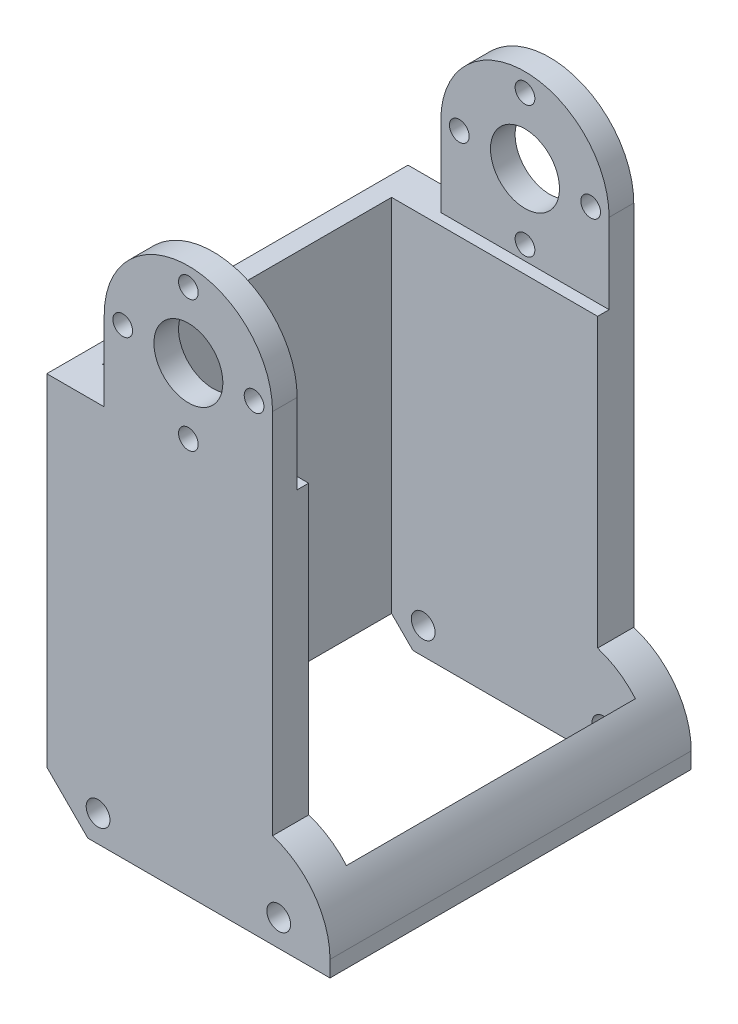
ISO-10303-21;
HEADER;
FILE_DESCRIPTION(('STEP AP214'),'2;1');
FILE_NAME('part.step','',(''),(''),'','','');
FILE_SCHEMA(('AUTOMOTIVE_DESIGN { 1 0 10303 214 1 1 1 1 }'));
ENDSEC;
DATA;
#1=APPLICATION_CONTEXT('core data for automotive mechanical design processes');
#2=APPLICATION_PROTOCOL_DEFINITION('international standard','automotive_design',2000,#1);
#3=PRODUCT_CONTEXT('',#1,'mechanical');
#4=PRODUCT('Part','Part','',(#3));
#5=PRODUCT_RELATED_PRODUCT_CATEGORY('part','',(#4));
#6=PRODUCT_DEFINITION_FORMATION('','',#4);
#7=PRODUCT_DEFINITION_CONTEXT('part definition',#1,'design');
#8=PRODUCT_DEFINITION('design','',#6,#7);
#9=PRODUCT_DEFINITION_SHAPE('','',#8);
#10=(LENGTH_UNIT() NAMED_UNIT(*) SI_UNIT(.MILLI.,.METRE.));
#11=(NAMED_UNIT(*) PLANE_ANGLE_UNIT() SI_UNIT($,.RADIAN.));
#12=(NAMED_UNIT(*) SI_UNIT($,.STERADIAN.) SOLID_ANGLE_UNIT());
#13=UNCERTAINTY_MEASURE_WITH_UNIT(LENGTH_MEASURE(1.E-05),#10,'distance_accuracy_value','');
#14=(GEOMETRIC_REPRESENTATION_CONTEXT(3) GLOBAL_UNCERTAINTY_ASSIGNED_CONTEXT((#13)) GLOBAL_UNIT_ASSIGNED_CONTEXT((#10,
#11,#12)) REPRESENTATION_CONTEXT('',''));
#15=CARTESIAN_POINT('',(0.,0.,0.));
#16=DIRECTION('',(0.,0.,1.));
#17=DIRECTION('',(1.,0.,0.));
#18=AXIS2_PLACEMENT_3D('',#15,#16,#17);
#19=CARTESIAN_POINT('',(0.,0.,-22.));
#20=DIRECTION('',(0.,0.,1.));
#21=DIRECTION('',(1.,0.,0.));
#22=AXIS2_PLACEMENT_3D('',#19,#20,#21);
#23=PLANE('',#22);
#24=CARTESIAN_POINT('',(-8.,0.,-22.));
#25=DIRECTION('',(0.,0.,1.));
#26=DIRECTION('',(1.,0.,0.));
#27=AXIS2_PLACEMENT_3D('',#24,#25,#26);
#28=CIRCLE('',#27,1.2);
#29=CARTESIAN_POINT('',(-6.8,0.,-22.));
#30=VERTEX_POINT('',#29);
#31=EDGE_CURVE('E469',#30,#30,#28,.T.);
#32=ORIENTED_EDGE('',*,*,#31,.T.);
#33=EDGE_LOOP('',(#32));
#34=FACE_BOUND('',#33,.T.);
#35=CARTESIAN_POINT('',(0.,8.,-22.));
#36=DIRECTION('',(0.,0.,1.));
#37=DIRECTION('',(1.,0.,0.));
#38=AXIS2_PLACEMENT_3D('',#35,#36,#37);
#39=CIRCLE('',#38,1.2);
#40=CARTESIAN_POINT('',(1.2,8.,-22.));
#41=VERTEX_POINT('',#40);
#42=EDGE_CURVE('E473',#41,#41,#39,.T.);
#43=ORIENTED_EDGE('',*,*,#42,.T.);
#44=EDGE_LOOP('',(#43));
#45=FACE_BOUND('',#44,.T.);
#46=CARTESIAN_POINT('',(8.,0.,-22.));
#47=DIRECTION('',(0.,0.,1.));
#48=DIRECTION('',(1.,0.,0.));
#49=AXIS2_PLACEMENT_3D('',#46,#47,#48);
#50=CIRCLE('',#49,1.2);
#51=CARTESIAN_POINT('',(9.2,0.,-22.));
#52=VERTEX_POINT('',#51);
#53=EDGE_CURVE('E477',#52,#52,#50,.T.);
#54=ORIENTED_EDGE('',*,*,#53,.T.);
#55=EDGE_LOOP('',(#54));
#56=FACE_BOUND('',#55,.T.);
#57=CARTESIAN_POINT('',(0.,0.,-22.));
#58=DIRECTION('',(0.,0.,1.));
#59=DIRECTION('',(1.,0.,0.));
#60=AXIS2_PLACEMENT_3D('',#57,#58,#59);
#61=CIRCLE('',#60,4.2);
#62=CARTESIAN_POINT('',(4.2,0.,-22.));
#63=VERTEX_POINT('',#62);
#64=EDGE_CURVE('E481',#63,#63,#61,.T.);
#65=ORIENTED_EDGE('',*,*,#64,.T.);
#66=EDGE_LOOP('',(#65));
#67=FACE_BOUND('',#66,.T.);
#68=CARTESIAN_POINT('',(0.,-8.,-22.));
#69=DIRECTION('',(0.,0.,1.));
#70=DIRECTION('',(1.,0.,0.));
#71=AXIS2_PLACEMENT_3D('',#68,#69,#70);
#72=CIRCLE('',#71,1.2);
#73=CARTESIAN_POINT('',(1.19999999999994,-8.,-22.));
#74=VERTEX_POINT('',#73);
#75=EDGE_CURVE('E496',#74,#74,#72,.T.);
#76=ORIENTED_EDGE('',*,*,#75,.T.);
#77=EDGE_LOOP('',(#76));
#78=FACE_BOUND('',#77,.T.);
#79=CARTESIAN_POINT('',(11.,-53.,-22.));
#80=DIRECTION('',(0.,0.,1.));
#81=DIRECTION('',(1.,0.,0.));
#82=AXIS2_PLACEMENT_3D('',#79,#80,#81);
#83=CIRCLE('',#82,1.45);
#84=CARTESIAN_POINT('',(12.45,-53.,-22.));
#85=VERTEX_POINT('',#84);
#86=EDGE_CURVE('E350',#85,#85,#83,.T.);
#87=ORIENTED_EDGE('',*,*,#86,.T.);
#88=EDGE_LOOP('',(#87));
#89=FACE_BOUND('',#88,.T.);
#90=CARTESIAN_POINT('',(-11.,-53.,-22.));
#91=DIRECTION('',(0.,0.,1.));
#92=DIRECTION('',(1.,0.,0.));
#93=AXIS2_PLACEMENT_3D('',#90,#91,#92);
#94=CIRCLE('',#93,1.45);
#95=CARTESIAN_POINT('',(-9.55,-53.,-22.));
#96=VERTEX_POINT('',#95);
#97=EDGE_CURVE('E338',#96,#96,#94,.T.);
#98=ORIENTED_EDGE('',*,*,#97,.T.);
#99=EDGE_LOOP('',(#98));
#100=FACE_BOUND('',#99,.T.);
#101=DIRECTION('',(0.,-1.,0.));
#102=VECTOR('',#101,1.);
#103=CARTESIAN_POINT('',(10.25,0.,-22.));
#104=LINE('',#103,#102);
#105=CARTESIAN_POINT('',(10.25,0.,-22.));
#106=VERTEX_POINT('',#105);
#107=CARTESIAN_POINT('',(10.25,-44.75,-22.));
#108=VERTEX_POINT('',#107);
#109=EDGE_CURVE('E493',#106,#108,#104,.T.);
#110=ORIENTED_EDGE('',*,*,#109,.T.);
#111=CARTESIAN_POINT('',(7.25,-54.2893920141695,-22.));
#112=DIRECTION('',(0.,0.,1.));
#113=DIRECTION('',(1.,0.,0.));
#114=AXIS2_PLACEMENT_3D('',#111,#112,#113);
#115=CIRCLE('',#114,10.);
#116=CARTESIAN_POINT('',(17.25,-54.2893920141695,-22.));
#117=VERTEX_POINT('',#116);
#118=EDGE_CURVE('E132',#108,#117,#115,.F.);
#119=ORIENTED_EDGE('',*,*,#118,.T.);
#120=DIRECTION('',(0.,1.,0.));
#121=VECTOR('',#120,1.);
#122=CARTESIAN_POINT('',(17.25,-75.25,-22.));
#123=LINE('',#122,#121);
#124=CARTESIAN_POINT('',(17.25,-56.25,-22.));
#125=VERTEX_POINT('',#124);
#126=EDGE_CURVE('E342',#125,#117,#123,.T.);
#127=ORIENTED_EDGE('',*,*,#126,.F.);
#128=DIRECTION('',(1.,0.,0.));
#129=VECTOR('',#128,1.);
#130=CARTESIAN_POINT('',(0.,-56.25,-22.));
#131=LINE('',#130,#129);
#132=CARTESIAN_POINT('',(-12.25,-56.25,-22.));
#133=VERTEX_POINT('',#132);
#134=EDGE_CURVE('E331',#133,#125,#131,.T.);
#135=ORIENTED_EDGE('',*,*,#134,.F.);
#136=DIRECTION('',(0.707106781186544,-0.707106781186551,0.));
#137=VECTOR('',#136,1.);
#138=CARTESIAN_POINT('',(-17.25,-51.2499999999999,-22.));
#139=LINE('',#138,#137);
#140=CARTESIAN_POINT('',(-17.25,-51.2499999999999,-22.));
#141=VERTEX_POINT('',#140);
#142=EDGE_CURVE('E547',#133,#141,#139,.F.);
#143=ORIENTED_EDGE('',*,*,#142,.T.);
#144=DIRECTION('',(0.,1.,0.));
#145=VECTOR('',#144,1.);
#146=CARTESIAN_POINT('',(-17.25,-75.25,-22.));
#147=LINE('',#146,#145);
#148=CARTESIAN_POINT('',(-17.25,-9.75,-22.));
#149=VERTEX_POINT('',#148);
#150=EDGE_CURVE('E376',#141,#149,#147,.T.);
#151=ORIENTED_EDGE('',*,*,#150,.T.);
#152=DIRECTION('',(-1.,0.,0.));
#153=VECTOR('',#152,1.);
#154=CARTESIAN_POINT('',(-10.25,-9.75,-22.));
#155=LINE('',#154,#153);
#156=CARTESIAN_POINT('',(-10.25,-9.75,-22.));
#157=VERTEX_POINT('',#156);
#158=EDGE_CURVE('E365',#157,#149,#155,.T.);
#159=ORIENTED_EDGE('',*,*,#158,.F.);
#160=DIRECTION('',(0.,-1.,0.));
#161=VECTOR('',#160,1.);
#162=CARTESIAN_POINT('',(-10.25,0.,-22.));
#163=LINE('',#162,#161);
#164=CARTESIAN_POINT('',(-10.25,0.,-22.));
#165=VERTEX_POINT('',#164);
#166=EDGE_CURVE('E489',#165,#157,#163,.T.);
#167=ORIENTED_EDGE('',*,*,#166,.F.);
#168=CARTESIAN_POINT('',(0.,0.,-22.));
#169=DIRECTION('',(0.,0.,1.));
#170=DIRECTION('',(1.,0.,0.));
#171=AXIS2_PLACEMENT_3D('',#168,#169,#170);
#172=CIRCLE('',#171,10.25);
#173=EDGE_CURVE('E485',#106,#165,#172,.T.);
#174=ORIENTED_EDGE('',*,*,#173,.F.);
#175=EDGE_LOOP('',(#110,#119,#127,#135,#143,#151,#159,#167,#174));
#176=FACE_BOUND('',#175,.T.);
#177=ADVANCED_FACE('F109',(#34,#45,#56,#67,#78,#89,#100,#176),#23,.F.);
#178=CARTESIAN_POINT('',(0.,0.,22.));
#179=DIRECTION('',(0.,0.,1.));
#180=DIRECTION('',(1.,0.,0.));
#181=AXIS2_PLACEMENT_3D('',#178,#179,#180);
#182=PLANE('',#181);
#183=DIRECTION('',(0.,1.,0.));
#184=VECTOR('',#183,1.);
#185=CARTESIAN_POINT('',(17.25,-75.25,22.));
#186=LINE('',#185,#184);
#187=CARTESIAN_POINT('',(17.25,-56.25,22.));
#188=VERTEX_POINT('',#187);
#189=CARTESIAN_POINT('',(17.25,-54.2893920141695,22.));
#190=VERTEX_POINT('',#189);
#191=EDGE_CURVE('E252',#188,#190,#186,.T.);
#192=ORIENTED_EDGE('',*,*,#191,.T.);
#193=CARTESIAN_POINT('',(7.25,-54.2893920141695,22.));
#194=DIRECTION('',(0.,0.,1.));
#195=DIRECTION('',(1.,0.,0.));
#196=AXIS2_PLACEMENT_3D('',#193,#194,#195);
#197=CIRCLE('',#196,10.);
#198=CARTESIAN_POINT('',(10.25,-44.75,22.));
#199=VERTEX_POINT('',#198);
#200=EDGE_CURVE('E12',#190,#199,#197,.T.);
#201=ORIENTED_EDGE('',*,*,#200,.T.);
#202=DIRECTION('',(0.,-1.,0.));
#203=VECTOR('',#202,1.);
#204=CARTESIAN_POINT('',(10.25,0.,22.));
#205=LINE('',#204,#203);
#206=CARTESIAN_POINT('',(10.25,0.,22.));
#207=VERTEX_POINT('',#206);
#208=EDGE_CURVE('E251',#207,#199,#205,.T.);
#209=ORIENTED_EDGE('',*,*,#208,.F.);
#210=CARTESIAN_POINT('',(0.,0.,22.));
#211=DIRECTION('',(0.,0.,1.));
#212=DIRECTION('',(1.,0.,0.));
#213=AXIS2_PLACEMENT_3D('',#210,#211,#212);
#214=CIRCLE('',#213,10.25);
#215=CARTESIAN_POINT('',(-10.25,0.,22.));
#216=VERTEX_POINT('',#215);
#217=EDGE_CURVE('E460',#207,#216,#214,.T.);
#218=ORIENTED_EDGE('',*,*,#217,.T.);
#219=DIRECTION('',(0.,-1.,0.));
#220=VECTOR('',#219,1.);
#221=CARTESIAN_POINT('',(-10.25,0.,22.));
#222=LINE('',#221,#220);
#223=CARTESIAN_POINT('',(-10.25,-9.75,22.));
#224=VERTEX_POINT('',#223);
#225=EDGE_CURVE('E266',#216,#224,#222,.T.);
#226=ORIENTED_EDGE('',*,*,#225,.T.);
#227=DIRECTION('',(1.,0.,0.));
#228=VECTOR('',#227,1.);
#229=CARTESIAN_POINT('',(-10.25,-9.75,22.));
#230=LINE('',#229,#228);
#231=CARTESIAN_POINT('',(-17.25,-9.75,22.));
#232=VERTEX_POINT('',#231);
#233=EDGE_CURVE('E373',#232,#224,#230,.T.);
#234=ORIENTED_EDGE('',*,*,#233,.F.);
#235=DIRECTION('',(0.,1.,0.));
#236=VECTOR('',#235,1.);
#237=CARTESIAN_POINT('',(-17.25,-75.25,22.));
#238=LINE('',#237,#236);
#239=CARTESIAN_POINT('',(-17.25,-51.2499999999999,22.));
#240=VERTEX_POINT('',#239);
#241=EDGE_CURVE('E377',#240,#232,#238,.T.);
#242=ORIENTED_EDGE('',*,*,#241,.F.);
#243=DIRECTION('',(-0.707106781186544,0.707106781186551,0.));
#244=VECTOR('',#243,1.);
#245=CARTESIAN_POINT('',(-34.25,-34.2499999999997,22.));
#246=LINE('',#245,#244);
#247=CARTESIAN_POINT('',(-12.25,-56.25,22.));
#248=VERTEX_POINT('',#247);
#249=EDGE_CURVE('E529',#240,#248,#246,.F.);
#250=ORIENTED_EDGE('',*,*,#249,.T.);
#251=DIRECTION('',(1.,0.,0.));
#252=VECTOR('',#251,1.);
#253=CARTESIAN_POINT('',(0.,-56.25,22.));
#254=LINE('',#253,#252);
#255=EDGE_CURVE('E335',#248,#188,#254,.T.);
#256=ORIENTED_EDGE('',*,*,#255,.T.);
#257=EDGE_LOOP('',(#192,#201,#209,#218,#226,#234,#242,#250,#256));
#258=FACE_BOUND('',#257,.T.);
#259=CARTESIAN_POINT('',(0.,-8.,22.));
#260=DIRECTION('',(0.,0.,1.));
#261=DIRECTION('',(1.,0.,0.));
#262=AXIS2_PLACEMENT_3D('',#259,#260,#261);
#263=CIRCLE('',#262,1.2);
#264=CARTESIAN_POINT('',(1.19999999999994,-8.,22.));
#265=VERTEX_POINT('',#264);
#266=EDGE_CURVE('E265',#265,#265,#263,.T.);
#267=ORIENTED_EDGE('',*,*,#266,.F.);
#268=EDGE_LOOP('',(#267));
#269=FACE_BOUND('',#268,.T.);
#270=CARTESIAN_POINT('',(0.,0.,22.));
#271=DIRECTION('',(0.,0.,1.));
#272=DIRECTION('',(1.,0.,0.));
#273=AXIS2_PLACEMENT_3D('',#270,#271,#272);
#274=CIRCLE('',#273,4.2);
#275=CARTESIAN_POINT('',(4.2,0.,22.));
#276=VERTEX_POINT('',#275);
#277=EDGE_CURVE('E456',#276,#276,#274,.T.);
#278=ORIENTED_EDGE('',*,*,#277,.F.);
#279=EDGE_LOOP('',(#278));
#280=FACE_BOUND('',#279,.T.);
#281=CARTESIAN_POINT('',(8.,0.,22.));
#282=DIRECTION('',(0.,0.,1.));
#283=DIRECTION('',(1.,0.,0.));
#284=AXIS2_PLACEMENT_3D('',#281,#282,#283);
#285=CIRCLE('',#284,1.2);
#286=CARTESIAN_POINT('',(9.2,0.,22.));
#287=VERTEX_POINT('',#286);
#288=EDGE_CURVE('E452',#287,#287,#285,.T.);
#289=ORIENTED_EDGE('',*,*,#288,.F.);
#290=EDGE_LOOP('',(#289));
#291=FACE_BOUND('',#290,.T.);
#292=CARTESIAN_POINT('',(0.,8.,22.));
#293=DIRECTION('',(0.,0.,1.));
#294=DIRECTION('',(1.,0.,0.));
#295=AXIS2_PLACEMENT_3D('',#292,#293,#294);
#296=CIRCLE('',#295,1.2);
#297=CARTESIAN_POINT('',(1.2,8.,22.));
#298=VERTEX_POINT('',#297);
#299=EDGE_CURVE('E448',#298,#298,#296,.T.);
#300=ORIENTED_EDGE('',*,*,#299,.F.);
#301=EDGE_LOOP('',(#300));
#302=FACE_BOUND('',#301,.T.);
#303=CARTESIAN_POINT('',(-8.,0.,22.));
#304=DIRECTION('',(0.,0.,1.));
#305=DIRECTION('',(1.,0.,0.));
#306=AXIS2_PLACEMENT_3D('',#303,#304,#305);
#307=CIRCLE('',#306,1.2);
#308=CARTESIAN_POINT('',(-6.8,0.,22.));
#309=VERTEX_POINT('',#308);
#310=EDGE_CURVE('E444',#309,#309,#307,.T.);
#311=ORIENTED_EDGE('',*,*,#310,.F.);
#312=EDGE_LOOP('',(#311));
#313=FACE_BOUND('',#312,.T.);
#314=CARTESIAN_POINT('',(11.,-53.,22.));
#315=DIRECTION('',(0.,0.,1.));
#316=DIRECTION('',(1.,0.,0.));
#317=AXIS2_PLACEMENT_3D('',#314,#315,#316);
#318=CIRCLE('',#317,1.45);
#319=CARTESIAN_POINT('',(12.45,-53.,22.));
#320=VERTEX_POINT('',#319);
#321=EDGE_CURVE('E330',#320,#320,#318,.T.);
#322=ORIENTED_EDGE('',*,*,#321,.F.);
#323=EDGE_LOOP('',(#322));
#324=FACE_BOUND('',#323,.T.);
#325=CARTESIAN_POINT('',(-11.,-53.,22.));
#326=DIRECTION('',(0.,0.,1.));
#327=DIRECTION('',(1.,0.,0.));
#328=AXIS2_PLACEMENT_3D('',#325,#326,#327);
#329=CIRCLE('',#328,1.45);
#330=CARTESIAN_POINT('',(-9.55,-53.,22.));
#331=VERTEX_POINT('',#330);
#332=EDGE_CURVE('E346',#331,#331,#329,.T.);
#333=ORIENTED_EDGE('',*,*,#332,.F.);
#334=EDGE_LOOP('',(#333));
#335=FACE_BOUND('',#334,.T.);
#336=ADVANCED_FACE('F248',(#258,#269,#280,#291,#302,#313,#324,#335),#182,.T.);
#337=CARTESIAN_POINT('',(-17.25,-75.25,-22.));
#338=DIRECTION('',(-1.,0.,0.));
#339=DIRECTION('',(0.,0.,1.));
#340=AXIS2_PLACEMENT_3D('',#337,#338,#339);
#341=PLANE('',#340);
#342=ORIENTED_EDGE('',*,*,#150,.F.);
#343=DIRECTION('',(0.,0.,1.));
#344=VECTOR('',#343,1.);
#345=CARTESIAN_POINT('',(-17.25,-51.2499999999999,-22.));
#346=LINE('',#345,#344);
#347=EDGE_CURVE('E525',#141,#240,#346,.T.);
#348=ORIENTED_EDGE('',*,*,#347,.T.);
#349=ORIENTED_EDGE('',*,*,#241,.T.);
#350=DIRECTION('',(0.,0.,1.));
#351=VECTOR('',#350,1.);
#352=CARTESIAN_POINT('',(-17.25,-9.75,-22.));
#353=LINE('',#352,#351);
#354=EDGE_CURVE('E369',#149,#232,#353,.T.);
#355=ORIENTED_EDGE('',*,*,#354,.F.);
#356=EDGE_LOOP('',(#342,#348,#349,#355));
#357=FACE_BOUND('',#356,.T.);
#358=ADVANCED_FACE('F612',(#357),#341,.T.);
#359=CARTESIAN_POINT('',(17.25,-75.25,-22.));
#360=DIRECTION('',(1.,0.,0.));
#361=DIRECTION('',(0.,0.,-1.));
#362=AXIS2_PLACEMENT_3D('',#359,#360,#361);
#363=PLANE('',#362);
#364=ORIENTED_EDGE('',*,*,#126,.T.);
#365=DIRECTION('',(0.,0.,1.));
#366=VECTOR('',#365,1.);
#367=CARTESIAN_POINT('',(17.25,-54.2893920141695,22.));
#368=LINE('',#367,#366);
#369=EDGE_CURVE('E118',#117,#190,#368,.T.);
#370=ORIENTED_EDGE('',*,*,#369,.T.);
#371=ORIENTED_EDGE('',*,*,#191,.F.);
#372=DIRECTION('',(0.,0.,1.));
#373=VECTOR('',#372,1.);
#374=CARTESIAN_POINT('',(17.25,-56.25,-22.));
#375=LINE('',#374,#373);
#376=EDGE_CURVE('E334',#125,#188,#375,.T.);
#377=ORIENTED_EDGE('',*,*,#376,.F.);
#378=EDGE_LOOP('',(#364,#370,#371,#377));
#379=FACE_BOUND('',#378,.T.);
#380=ADVANCED_FACE('F608',(#379),#363,.T.);
#381=CARTESIAN_POINT('',(10.25,0.,-22.));
#382=DIRECTION('',(-1.,0.,0.));
#383=DIRECTION('',(0.,0.,1.));
#384=AXIS2_PLACEMENT_3D('',#381,#382,#383);
#385=PLANE('',#384);
#386=ORIENTED_EDGE('',*,*,#208,.T.);
#387=DIRECTION('',(0.,0.,-1.));
#388=VECTOR('',#387,1.);
#389=CARTESIAN_POINT('',(10.25,-44.75,22.));
#390=LINE('',#389,#388);
#391=CARTESIAN_POINT('',(10.25,-44.75,17.6));
#392=VERTEX_POINT('',#391);
#393=EDGE_CURVE('E258',#199,#392,#390,.T.);
#394=ORIENTED_EDGE('',*,*,#393,.T.);
#395=DIRECTION('',(0.,-1.,0.));
#396=VECTOR('',#395,1.);
#397=CARTESIAN_POINT('',(10.25,10.25,17.6));
#398=LINE('',#397,#396);
#399=CARTESIAN_POINT('',(10.25,-9.75,17.6));
#400=VERTEX_POINT('',#399);
#401=EDGE_CURVE('E280',#400,#392,#398,.T.);
#402=ORIENTED_EDGE('',*,*,#401,.F.);
#403=DIRECTION('',(0.,0.,-1.));
#404=VECTOR('',#403,1.);
#405=CARTESIAN_POINT('',(10.25,-9.75,22.));
#406=LINE('',#405,#404);
#407=CARTESIAN_POINT('',(10.25,-9.75,19.));
#408=VERTEX_POINT('',#407);
#409=EDGE_CURVE('E276',#408,#400,#406,.T.);
#410=ORIENTED_EDGE('',*,*,#409,.F.);
#411=DIRECTION('',(0.,1.,0.));
#412=VECTOR('',#411,1.);
#413=CARTESIAN_POINT('',(10.25,10.25,19.));
#414=LINE('',#413,#412);
#415=CARTESIAN_POINT('',(10.25,0.,19.));
#416=VERTEX_POINT('',#415);
#417=EDGE_CURVE('E387',#408,#416,#414,.T.);
#418=ORIENTED_EDGE('',*,*,#417,.T.);
#419=DIRECTION('',(0.,0.,1.));
#420=VECTOR('',#419,1.);
#421=CARTESIAN_POINT('',(10.25,0.,-22.));
#422=LINE('',#421,#420);
#423=EDGE_CURVE('E262',#416,#207,#422,.T.);
#424=ORIENTED_EDGE('',*,*,#423,.T.);
#425=EDGE_LOOP('',(#386,#394,#402,#410,#418,#424));
#426=FACE_BOUND('',#425,.T.);
#427=ADVANCED_FACE('F257',(#426),#385,.F.);
#428=CARTESIAN_POINT('',(-10.25,0.,-22.));
#429=DIRECTION('',(-1.,0.,0.));
#430=DIRECTION('',(0.,0.,1.));
#431=AXIS2_PLACEMENT_3D('',#428,#429,#430);
#432=PLANE('',#431);
#433=ORIENTED_EDGE('',*,*,#166,.T.);
#434=DIRECTION('',(0.,0.,-1.));
#435=VECTOR('',#434,1.);
#436=CARTESIAN_POINT('',(-10.25,-9.75,-22.));
#437=LINE('',#436,#435);
#438=CARTESIAN_POINT('',(-10.25,-9.75,-19.));
#439=VERTEX_POINT('',#438);
#440=EDGE_CURVE('E359',#439,#157,#437,.T.);
#441=ORIENTED_EDGE('',*,*,#440,.F.);
#442=DIRECTION('',(0.,-1.,0.));
#443=VECTOR('',#442,1.);
#444=CARTESIAN_POINT('',(-10.25,10.25,-19.));
#445=LINE('',#444,#443);
#446=CARTESIAN_POINT('',(-10.25,0.,-19.));
#447=VERTEX_POINT('',#446);
#448=EDGE_CURVE('E380',#447,#439,#445,.T.);
#449=ORIENTED_EDGE('',*,*,#448,.F.);
#450=DIRECTION('',(0.,0.,1.));
#451=VECTOR('',#450,1.);
#452=CARTESIAN_POINT('',(-10.25,0.,-22.));
#453=LINE('',#452,#451);
#454=EDGE_CURVE('E506',#165,#447,#453,.T.);
#455=ORIENTED_EDGE('',*,*,#454,.F.);
#456=EDGE_LOOP('',(#433,#441,#449,#455));
#457=FACE_BOUND('',#456,.T.);
#458=ADVANCED_FACE('F618',(#457),#432,.T.);
#459=DIRECTION('',(0.,1.,0.));
#460=VECTOR('',#459,1.);
#461=CARTESIAN_POINT('',(-10.25,10.25,19.));
#462=LINE('',#461,#460);
#463=CARTESIAN_POINT('',(-10.25,-9.75,19.));
#464=VERTEX_POINT('',#463);
#465=CARTESIAN_POINT('',(-10.25,0.,19.));
#466=VERTEX_POINT('',#465);
#467=EDGE_CURVE('E388',#464,#466,#462,.T.);
#468=ORIENTED_EDGE('',*,*,#467,.F.);
#469=EDGE_CURVE('E362',#224,#464,#437,.T.);
#470=ORIENTED_EDGE('',*,*,#469,.F.);
#471=ORIENTED_EDGE('',*,*,#225,.F.);
#472=EDGE_CURVE('E500',#466,#216,#453,.T.);
#473=ORIENTED_EDGE('',*,*,#472,.F.);
#474=EDGE_LOOP('',(#468,#470,#471,#473));
#475=FACE_BOUND('',#474,.T.);
#476=ADVANCED_FACE('F702',(#475),#432,.T.);
#477=CARTESIAN_POINT('',(0.,0.,-22.));
#478=DIRECTION('',(0.,0.,1.));
#479=DIRECTION('',(1.,0.,0.));
#480=AXIS2_PLACEMENT_3D('',#477,#478,#479);
#481=CYLINDRICAL_SURFACE('',#480,10.25);
#482=CARTESIAN_POINT('',(0.,0.,-19.));
#483=DIRECTION('',(0.,0.,-1.));
#484=DIRECTION('',(-1.,0.,0.));
#485=AXIS2_PLACEMENT_3D('',#482,#483,#484);
#486=CIRCLE('',#485,10.25);
#487=CARTESIAN_POINT('',(10.25,0.,-19.));
#488=VERTEX_POINT('',#487);
#489=EDGE_CURVE('E441',#488,#447,#486,.F.);
#490=ORIENTED_EDGE('',*,*,#489,.F.);
#491=EDGE_CURVE('E501',#106,#488,#422,.T.);
#492=ORIENTED_EDGE('',*,*,#491,.F.);
#493=ORIENTED_EDGE('',*,*,#173,.T.);
#494=ORIENTED_EDGE('',*,*,#454,.T.);
#495=EDGE_LOOP('',(#490,#492,#493,#494));
#496=FACE_BOUND('',#495,.T.);
#497=ADVANCED_FACE('F622',(#496),#481,.T.);
#498=CARTESIAN_POINT('',(0.,0.,-22.));
#499=DIRECTION('',(0.,0.,1.));
#500=DIRECTION('',(1.,0.,0.));
#501=AXIS2_PLACEMENT_3D('',#498,#499,#500);
#502=CYLINDRICAL_SURFACE('',#501,4.2);
#503=CARTESIAN_POINT('',(0.,0.,-19.));
#504=DIRECTION('',(0.,0.,-1.));
#505=DIRECTION('',(-1.,0.,0.));
#506=AXIS2_PLACEMENT_3D('',#503,#504,#505);
#507=CIRCLE('',#506,4.2);
#508=CARTESIAN_POINT('',(-4.2,0.,-19.));
#509=VERTEX_POINT('',#508);
#510=EDGE_CURVE('E437',#509,#509,#507,.F.);
#511=ORIENTED_EDGE('',*,*,#510,.T.);
#512=EDGE_LOOP('',(#511));
#513=FACE_BOUND('',#512,.T.);
#514=ORIENTED_EDGE('',*,*,#64,.F.);
#515=EDGE_LOOP('',(#514));
#516=FACE_BOUND('',#515,.T.);
#517=ADVANCED_FACE('F640',(#513,#516),#502,.F.);
#518=CARTESIAN_POINT('',(8.,0.,-22.));
#519=DIRECTION('',(0.,0.,1.));
#520=DIRECTION('',(1.,0.,0.));
#521=AXIS2_PLACEMENT_3D('',#518,#519,#520);
#522=CYLINDRICAL_SURFACE('',#521,1.2);
#523=CARTESIAN_POINT('',(8.,0.,-19.));
#524=DIRECTION('',(0.,0.,-1.));
#525=DIRECTION('',(-1.,0.,0.));
#526=AXIS2_PLACEMENT_3D('',#523,#524,#525);
#527=CIRCLE('',#526,1.2);
#528=CARTESIAN_POINT('',(6.8,0.,-19.));
#529=VERTEX_POINT('',#528);
#530=EDGE_CURVE('E433',#529,#529,#527,.F.);
#531=ORIENTED_EDGE('',*,*,#530,.T.);
#532=EDGE_LOOP('',(#531));
#533=FACE_BOUND('',#532,.T.);
#534=ORIENTED_EDGE('',*,*,#53,.F.);
#535=EDGE_LOOP('',(#534));
#536=FACE_BOUND('',#535,.T.);
#537=ADVANCED_FACE('F643',(#533,#536),#522,.F.);
#538=CARTESIAN_POINT('',(0.,8.,-22.));
#539=DIRECTION('',(0.,0.,1.));
#540=DIRECTION('',(1.,0.,0.));
#541=AXIS2_PLACEMENT_3D('',#538,#539,#540);
#542=CYLINDRICAL_SURFACE('',#541,1.2);
#543=CARTESIAN_POINT('',(0.,8.,-19.));
#544=DIRECTION('',(0.,0.,-1.));
#545=DIRECTION('',(-1.,0.,0.));
#546=AXIS2_PLACEMENT_3D('',#543,#544,#545);
#547=CIRCLE('',#546,1.2);
#548=CARTESIAN_POINT('',(-1.2,8.,-19.));
#549=VERTEX_POINT('',#548);
#550=EDGE_CURVE('E429',#549,#549,#547,.F.);
#551=ORIENTED_EDGE('',*,*,#550,.T.);
#552=EDGE_LOOP('',(#551));
#553=FACE_BOUND('',#552,.T.);
#554=ORIENTED_EDGE('',*,*,#42,.F.);
#555=EDGE_LOOP('',(#554));
#556=FACE_BOUND('',#555,.T.);
#557=ADVANCED_FACE('F716',(#553,#556),#542,.F.);
#558=CARTESIAN_POINT('',(-8.,0.,-22.));
#559=DIRECTION('',(0.,0.,1.));
#560=DIRECTION('',(1.,0.,0.));
#561=AXIS2_PLACEMENT_3D('',#558,#559,#560);
#562=CYLINDRICAL_SURFACE('',#561,1.2);
#563=CARTESIAN_POINT('',(-8.,0.,-19.));
#564=DIRECTION('',(0.,0.,-1.));
#565=DIRECTION('',(-1.,0.,0.));
#566=AXIS2_PLACEMENT_3D('',#563,#564,#565);
#567=CIRCLE('',#566,1.2);
#568=CARTESIAN_POINT('',(-9.2,0.,-19.));
#569=VERTEX_POINT('',#568);
#570=EDGE_CURVE('E425',#569,#569,#567,.F.);
#571=ORIENTED_EDGE('',*,*,#570,.T.);
#572=EDGE_LOOP('',(#571));
#573=FACE_BOUND('',#572,.T.);
#574=ORIENTED_EDGE('',*,*,#31,.F.);
#575=EDGE_LOOP('',(#574));
#576=FACE_BOUND('',#575,.T.);
#577=ADVANCED_FACE('F719',(#573,#576),#562,.F.);
#578=CARTESIAN_POINT('',(0.,-8.,-22.));
#579=DIRECTION('',(0.,0.,1.));
#580=DIRECTION('',(1.,0.,0.));
#581=AXIS2_PLACEMENT_3D('',#578,#579,#580);
#582=CYLINDRICAL_SURFACE('',#581,1.2);
#583=CARTESIAN_POINT('',(0.,-8.,-19.));
#584=DIRECTION('',(0.,0.,-1.));
#585=DIRECTION('',(-1.,0.,0.));
#586=AXIS2_PLACEMENT_3D('',#583,#584,#585);
#587=CIRCLE('',#586,1.2);
#588=CARTESIAN_POINT('',(-1.20000000000006,-8.,-19.));
#589=VERTEX_POINT('',#588);
#590=EDGE_CURVE('E424',#589,#589,#587,.F.);
#591=ORIENTED_EDGE('',*,*,#590,.T.);
#592=EDGE_LOOP('',(#591));
#593=FACE_BOUND('',#592,.T.);
#594=ORIENTED_EDGE('',*,*,#75,.F.);
#595=EDGE_LOOP('',(#594));
#596=FACE_BOUND('',#595,.T.);
#597=ADVANCED_FACE('F696',(#593,#596),#582,.F.);
#598=CARTESIAN_POINT('',(0.,0.,19.));
#599=DIRECTION('',(0.,0.,1.));
#600=DIRECTION('',(0.,-1.,0.));
#601=AXIS2_PLACEMENT_3D('',#598,#599,#600);
#602=CIRCLE('',#601,10.25);
#603=EDGE_CURVE('E421',#466,#416,#602,.F.);
#604=ORIENTED_EDGE('',*,*,#603,.F.);
#605=ORIENTED_EDGE('',*,*,#472,.T.);
#606=ORIENTED_EDGE('',*,*,#217,.F.);
#607=ORIENTED_EDGE('',*,*,#423,.F.);
#608=EDGE_LOOP('',(#604,#605,#606,#607));
#609=FACE_BOUND('',#608,.T.);
#610=ADVANCED_FACE('F699',(#609),#481,.T.);
#611=DIRECTION('',(0.,-1.,0.));
#612=VECTOR('',#611,1.);
#613=CARTESIAN_POINT('',(10.25,10.25,-19.));
#614=LINE('',#613,#612);
#615=CARTESIAN_POINT('',(10.25,-9.75,-19.));
#616=VERTEX_POINT('',#615);
#617=EDGE_CURVE('E383',#488,#616,#614,.T.);
#618=ORIENTED_EDGE('',*,*,#617,.T.);
#619=CARTESIAN_POINT('',(10.25,-9.75,-17.6));
#620=VERTEX_POINT('',#619);
#621=EDGE_CURVE('E271',#620,#616,#406,.T.);
#622=ORIENTED_EDGE('',*,*,#621,.F.);
#623=DIRECTION('',(0.,1.,0.));
#624=VECTOR('',#623,1.);
#625=CARTESIAN_POINT('',(10.25,10.25,-17.6));
#626=LINE('',#625,#624);
#627=CARTESIAN_POINT('',(10.25,-44.75,-17.6));
#628=VERTEX_POINT('',#627);
#629=EDGE_CURVE('E505',#628,#620,#626,.T.);
#630=ORIENTED_EDGE('',*,*,#629,.F.);
#631=EDGE_CURVE('E272',#628,#108,#390,.T.);
#632=ORIENTED_EDGE('',*,*,#631,.T.);
#633=ORIENTED_EDGE('',*,*,#109,.F.);
#634=ORIENTED_EDGE('',*,*,#491,.T.);
#635=EDGE_LOOP('',(#618,#622,#630,#632,#633,#634));
#636=FACE_BOUND('',#635,.T.);
#637=ADVANCED_FACE('F588',(#636),#385,.F.);
#638=CARTESIAN_POINT('',(0.,0.,19.));
#639=DIRECTION('',(0.,0.,1.));
#640=DIRECTION('',(0.,-1.,0.));
#641=AXIS2_PLACEMENT_3D('',#638,#639,#640);
#642=CIRCLE('',#641,4.2);
#643=CARTESIAN_POINT('',(0.,-4.2,19.));
#644=VERTEX_POINT('',#643);
#645=EDGE_CURVE('E417',#644,#644,#642,.F.);
#646=ORIENTED_EDGE('',*,*,#645,.T.);
#647=EDGE_LOOP('',(#646));
#648=FACE_BOUND('',#647,.T.);
#649=ORIENTED_EDGE('',*,*,#277,.T.);
#650=EDGE_LOOP('',(#649));
#651=FACE_BOUND('',#650,.T.);
#652=ADVANCED_FACE('F645',(#648,#651),#502,.F.);
#653=CARTESIAN_POINT('',(8.,0.,19.));
#654=DIRECTION('',(0.,0.,1.));
#655=DIRECTION('',(0.,-1.,0.));
#656=AXIS2_PLACEMENT_3D('',#653,#654,#655);
#657=CIRCLE('',#656,1.2);
#658=CARTESIAN_POINT('',(8.,-1.20000000000003,19.));
#659=VERTEX_POINT('',#658);
#660=EDGE_CURVE('E413',#659,#659,#657,.F.);
#661=ORIENTED_EDGE('',*,*,#660,.T.);
#662=EDGE_LOOP('',(#661));
#663=FACE_BOUND('',#662,.T.);
#664=ORIENTED_EDGE('',*,*,#288,.T.);
#665=EDGE_LOOP('',(#664));
#666=FACE_BOUND('',#665,.T.);
#667=ADVANCED_FACE('F707',(#663,#666),#522,.F.);
#668=CARTESIAN_POINT('',(0.,8.,19.));
#669=DIRECTION('',(0.,0.,1.));
#670=DIRECTION('',(0.,-1.,0.));
#671=AXIS2_PLACEMENT_3D('',#668,#669,#670);
#672=CIRCLE('',#671,1.2);
#673=CARTESIAN_POINT('',(0.,6.8,19.));
#674=VERTEX_POINT('',#673);
#675=EDGE_CURVE('E409',#674,#674,#672,.F.);
#676=ORIENTED_EDGE('',*,*,#675,.T.);
#677=EDGE_LOOP('',(#676));
#678=FACE_BOUND('',#677,.T.);
#679=ORIENTED_EDGE('',*,*,#299,.T.);
#680=EDGE_LOOP('',(#679));
#681=FACE_BOUND('',#680,.T.);
#682=ADVANCED_FACE('F711',(#678,#681),#542,.F.);
#683=CARTESIAN_POINT('',(-8.,0.,19.));
#684=DIRECTION('',(0.,0.,1.));
#685=DIRECTION('',(0.,-1.,0.));
#686=AXIS2_PLACEMENT_3D('',#683,#684,#685);
#687=CIRCLE('',#686,1.2);
#688=CARTESIAN_POINT('',(-8.,-1.19999999999992,19.));
#689=VERTEX_POINT('',#688);
#690=EDGE_CURVE('E405',#689,#689,#687,.F.);
#691=ORIENTED_EDGE('',*,*,#690,.T.);
#692=EDGE_LOOP('',(#691));
#693=FACE_BOUND('',#692,.T.);
#694=ORIENTED_EDGE('',*,*,#310,.T.);
#695=EDGE_LOOP('',(#694));
#696=FACE_BOUND('',#695,.T.);
#697=ADVANCED_FACE('F694',(#693,#696),#562,.F.);
#698=CARTESIAN_POINT('',(0.,-8.,19.));
#699=DIRECTION('',(0.,0.,1.));
#700=DIRECTION('',(0.,-1.,0.));
#701=AXIS2_PLACEMENT_3D('',#698,#699,#700);
#702=CIRCLE('',#701,1.2);
#703=CARTESIAN_POINT('',(0.,-9.2,19.));
#704=VERTEX_POINT('',#703);
#705=EDGE_CURVE('E401',#704,#704,#702,.F.);
#706=ORIENTED_EDGE('',*,*,#705,.T.);
#707=EDGE_LOOP('',(#706));
#708=FACE_BOUND('',#707,.T.);
#709=ORIENTED_EDGE('',*,*,#266,.T.);
#710=EDGE_LOOP('',(#709));
#711=FACE_BOUND('',#710,.T.);
#712=ADVANCED_FACE('F628',(#708,#711),#582,.F.);
#713=CARTESIAN_POINT('',(10.25,10.25,-19.));
#714=DIRECTION('',(0.,0.,-1.));
#715=DIRECTION('',(-1.,0.,0.));
#716=AXIS2_PLACEMENT_3D('',#713,#714,#715);
#717=PLANE('',#716);
#718=ORIENTED_EDGE('',*,*,#489,.T.);
#719=ORIENTED_EDGE('',*,*,#448,.T.);
#720=DIRECTION('',(-1.,0.,0.));
#721=VECTOR('',#720,1.);
#722=CARTESIAN_POINT('',(10.25,-9.75,-19.));
#723=LINE('',#722,#721);
#724=EDGE_CURVE('E391',#616,#439,#723,.T.);
#725=ORIENTED_EDGE('',*,*,#724,.F.);
#726=ORIENTED_EDGE('',*,*,#617,.F.);
#727=EDGE_LOOP('',(#718,#719,#725,#726));
#728=FACE_BOUND('',#727,.T.);
#729=ORIENTED_EDGE('',*,*,#530,.F.);
#730=EDGE_LOOP('',(#729));
#731=FACE_BOUND('',#730,.T.);
#732=ORIENTED_EDGE('',*,*,#570,.F.);
#733=EDGE_LOOP('',(#732));
#734=FACE_BOUND('',#733,.T.);
#735=ORIENTED_EDGE('',*,*,#590,.F.);
#736=EDGE_LOOP('',(#735));
#737=FACE_BOUND('',#736,.T.);
#738=ORIENTED_EDGE('',*,*,#550,.F.);
#739=EDGE_LOOP('',(#738));
#740=FACE_BOUND('',#739,.T.);
#741=ORIENTED_EDGE('',*,*,#510,.F.);
#742=EDGE_LOOP('',(#741));
#743=FACE_BOUND('',#742,.T.);
#744=ADVANCED_FACE('F624',(#728,#731,#734,#737,#740,#743),#717,.F.);
#745=CARTESIAN_POINT('',(10.25,10.25,19.));
#746=DIRECTION('',(0.,0.,1.));
#747=DIRECTION('',(0.,-1.,0.));
#748=AXIS2_PLACEMENT_3D('',#745,#746,#747);
#749=PLANE('',#748);
#750=ORIENTED_EDGE('',*,*,#603,.T.);
#751=ORIENTED_EDGE('',*,*,#417,.F.);
#752=DIRECTION('',(-1.,0.,0.));
#753=VECTOR('',#752,1.);
#754=CARTESIAN_POINT('',(10.25,-9.75,19.));
#755=LINE('',#754,#753);
#756=EDGE_CURVE('E397',#408,#464,#755,.T.);
#757=ORIENTED_EDGE('',*,*,#756,.T.);
#758=ORIENTED_EDGE('',*,*,#467,.T.);
#759=EDGE_LOOP('',(#750,#751,#757,#758));
#760=FACE_BOUND('',#759,.T.);
#761=ORIENTED_EDGE('',*,*,#660,.F.);
#762=EDGE_LOOP('',(#761));
#763=FACE_BOUND('',#762,.T.);
#764=ORIENTED_EDGE('',*,*,#690,.F.);
#765=EDGE_LOOP('',(#764));
#766=FACE_BOUND('',#765,.T.);
#767=ORIENTED_EDGE('',*,*,#705,.F.);
#768=EDGE_LOOP('',(#767));
#769=FACE_BOUND('',#768,.T.);
#770=ORIENTED_EDGE('',*,*,#675,.F.);
#771=EDGE_LOOP('',(#770));
#772=FACE_BOUND('',#771,.T.);
#773=ORIENTED_EDGE('',*,*,#645,.F.);
#774=EDGE_LOOP('',(#773));
#775=FACE_BOUND('',#774,.T.);
#776=ADVANCED_FACE('F627',(#760,#763,#766,#769,#772,#775),#749,.F.);
#777=CARTESIAN_POINT('',(10.25,-9.75,-19.));
#778=DIRECTION('',(0.,-1.,0.));
#779=DIRECTION('',(0.,0.,-1.));
#780=AXIS2_PLACEMENT_3D('',#777,#778,#779);
#781=PLANE('',#780);
#782=ORIENTED_EDGE('',*,*,#756,.F.);
#783=ORIENTED_EDGE('',*,*,#409,.T.);
#784=DIRECTION('',(-1.,0.,0.));
#785=VECTOR('',#784,1.);
#786=CARTESIAN_POINT('',(10.25,-9.75,17.6));
#787=LINE('',#786,#785);
#788=CARTESIAN_POINT('',(-14.85,-9.75,17.6));
#789=VERTEX_POINT('',#788);
#790=EDGE_CURVE('E323',#400,#789,#787,.T.);
#791=ORIENTED_EDGE('',*,*,#790,.T.);
#792=DIRECTION('',(0.,0.,-1.));
#793=VECTOR('',#792,1.);
#794=CARTESIAN_POINT('',(-14.85,-9.75,-19.));
#795=LINE('',#794,#793);
#796=CARTESIAN_POINT('',(-14.85,-9.75,-17.6));
#797=VERTEX_POINT('',#796);
#798=EDGE_CURVE('E326',#789,#797,#795,.T.);
#799=ORIENTED_EDGE('',*,*,#798,.T.);
#800=DIRECTION('',(1.,0.,0.));
#801=VECTOR('',#800,1.);
#802=CARTESIAN_POINT('',(10.25,-9.75,-17.6));
#803=LINE('',#802,#801);
#804=EDGE_CURVE('E314',#797,#620,#803,.T.);
#805=ORIENTED_EDGE('',*,*,#804,.T.);
#806=ORIENTED_EDGE('',*,*,#621,.T.);
#807=ORIENTED_EDGE('',*,*,#724,.T.);
#808=ORIENTED_EDGE('',*,*,#440,.T.);
#809=ORIENTED_EDGE('',*,*,#158,.T.);
#810=ORIENTED_EDGE('',*,*,#354,.T.);
#811=ORIENTED_EDGE('',*,*,#233,.T.);
#812=ORIENTED_EDGE('',*,*,#469,.T.);
#813=EDGE_LOOP('',(#782,#783,#791,#799,#805,#806,#807,#808,#809,#810,#811,#812));
#814=FACE_BOUND('',#813,.T.);
#815=ADVANCED_FACE('F568',(#814),#781,.F.);
#816=CARTESIAN_POINT('',(0.,-56.25,-22.));
#817=DIRECTION('',(0.,-1.,0.));
#818=DIRECTION('',(0.,0.,-1.));
#819=AXIS2_PLACEMENT_3D('',#816,#817,#818);
#820=PLANE('',#819);
#821=ORIENTED_EDGE('',*,*,#255,.F.);
#822=DIRECTION('',(0.,0.,-1.));
#823=VECTOR('',#822,1.);
#824=CARTESIAN_POINT('',(-12.25,-56.25,-22.));
#825=LINE('',#824,#823);
#826=CARTESIAN_POINT('',(-12.25,-56.25,17.6));
#827=VERTEX_POINT('',#826);
#828=EDGE_CURVE('E535',#248,#827,#825,.T.);
#829=ORIENTED_EDGE('',*,*,#828,.T.);
#830=DIRECTION('',(-1.,0.,0.));
#831=VECTOR('',#830,1.);
#832=CARTESIAN_POINT('',(-14.85,-56.25,17.6));
#833=LINE('',#832,#831);
#834=CARTESIAN_POINT('',(14.85,-56.25,17.6));
#835=VERTEX_POINT('',#834);
#836=EDGE_CURVE('E287',#835,#827,#833,.T.);
#837=ORIENTED_EDGE('',*,*,#836,.F.);
#838=DIRECTION('',(0.,0.,1.));
#839=VECTOR('',#838,1.);
#840=CARTESIAN_POINT('',(14.85,-56.25,-17.6));
#841=LINE('',#840,#839);
#842=CARTESIAN_POINT('',(14.85,-56.25,-17.6));
#843=VERTEX_POINT('',#842);
#844=EDGE_CURVE('E283',#843,#835,#841,.T.);
#845=ORIENTED_EDGE('',*,*,#844,.F.);
#846=DIRECTION('',(1.,0.,0.));
#847=VECTOR('',#846,1.);
#848=CARTESIAN_POINT('',(-14.85,-56.25,-17.6));
#849=LINE('',#848,#847);
#850=CARTESIAN_POINT('',(-12.25,-56.25,-17.6));
#851=VERTEX_POINT('',#850);
#852=EDGE_CURVE('E291',#851,#843,#849,.T.);
#853=ORIENTED_EDGE('',*,*,#852,.F.);
#854=DIRECTION('',(0.,0.,-1.));
#855=VECTOR('',#854,1.);
#856=CARTESIAN_POINT('',(-12.25,-56.25,-22.));
#857=LINE('',#856,#855);
#858=EDGE_CURVE('E532',#851,#133,#857,.T.);
#859=ORIENTED_EDGE('',*,*,#858,.T.);
#860=ORIENTED_EDGE('',*,*,#134,.T.);
#861=ORIENTED_EDGE('',*,*,#376,.T.);
#862=EDGE_LOOP('',(#821,#829,#837,#845,#853,#859,#860,#861));
#863=FACE_BOUND('',#862,.T.);
#864=ADVANCED_FACE('F599',(#863),#820,.T.);
#865=CARTESIAN_POINT('',(11.,-53.,-22.));
#866=DIRECTION('',(0.,0.,1.));
#867=DIRECTION('',(1.,0.,0.));
#868=AXIS2_PLACEMENT_3D('',#865,#866,#867);
#869=CYLINDRICAL_SURFACE('',#868,1.45);
#870=CARTESIAN_POINT('',(11.,-53.,17.6));
#871=DIRECTION('',(0.,0.,1.));
#872=DIRECTION('',(1.,0.,0.));
#873=AXIS2_PLACEMENT_3D('',#870,#871,#872);
#874=CIRCLE('',#873,1.45);
#875=CARTESIAN_POINT('',(12.45,-53.,17.6));
#876=VERTEX_POINT('',#875);
#877=EDGE_CURVE('E319',#876,#876,#874,.F.);
#878=ORIENTED_EDGE('',*,*,#877,.T.);
#879=EDGE_LOOP('',(#878));
#880=FACE_BOUND('',#879,.T.);
#881=ORIENTED_EDGE('',*,*,#321,.T.);
#882=EDGE_LOOP('',(#881));
#883=FACE_BOUND('',#882,.T.);
#884=ADVANCED_FACE('F671',(#880,#883),#869,.F.);
#885=CARTESIAN_POINT('',(-11.,-53.,-22.));
#886=DIRECTION('',(0.,0.,1.));
#887=DIRECTION('',(1.,0.,0.));
#888=AXIS2_PLACEMENT_3D('',#885,#886,#887);
#889=CYLINDRICAL_SURFACE('',#888,1.45);
#890=CARTESIAN_POINT('',(-11.,-53.,17.6));
#891=DIRECTION('',(0.,0.,1.));
#892=DIRECTION('',(1.,0.,0.));
#893=AXIS2_PLACEMENT_3D('',#890,#891,#892);
#894=CIRCLE('',#893,1.45);
#895=CARTESIAN_POINT('',(-9.55,-53.,17.6));
#896=VERTEX_POINT('',#895);
#897=EDGE_CURVE('E318',#896,#896,#894,.F.);
#898=ORIENTED_EDGE('',*,*,#897,.T.);
#899=EDGE_LOOP('',(#898));
#900=FACE_BOUND('',#899,.T.);
#901=ORIENTED_EDGE('',*,*,#332,.T.);
#902=EDGE_LOOP('',(#901));
#903=FACE_BOUND('',#902,.T.);
#904=ADVANCED_FACE('F663',(#900,#903),#889,.F.);
#905=CARTESIAN_POINT('',(11.,-53.,-17.6));
#906=DIRECTION('',(0.,0.,-1.));
#907=DIRECTION('',(-1.,0.,0.));
#908=AXIS2_PLACEMENT_3D('',#905,#906,#907);
#909=CIRCLE('',#908,1.45);
#910=CARTESIAN_POINT('',(9.55,-53.,-17.6));
#911=VERTEX_POINT('',#910);
#912=EDGE_CURVE('E310',#911,#911,#909,.F.);
#913=ORIENTED_EDGE('',*,*,#912,.T.);
#914=EDGE_LOOP('',(#913));
#915=FACE_BOUND('',#914,.T.);
#916=ORIENTED_EDGE('',*,*,#86,.F.);
#917=EDGE_LOOP('',(#916));
#918=FACE_BOUND('',#917,.T.);
#919=ADVANCED_FACE('F660',(#915,#918),#869,.F.);
#920=CARTESIAN_POINT('',(-11.,-53.,-17.6));
#921=DIRECTION('',(0.,0.,-1.));
#922=DIRECTION('',(-1.,0.,0.));
#923=AXIS2_PLACEMENT_3D('',#920,#921,#922);
#924=CIRCLE('',#923,1.45);
#925=CARTESIAN_POINT('',(-12.45,-53.,-17.6));
#926=VERTEX_POINT('',#925);
#927=EDGE_CURVE('E299',#926,#926,#924,.F.);
#928=ORIENTED_EDGE('',*,*,#927,.T.);
#929=EDGE_LOOP('',(#928));
#930=FACE_BOUND('',#929,.T.);
#931=ORIENTED_EDGE('',*,*,#97,.F.);
#932=EDGE_LOOP('',(#931));
#933=FACE_BOUND('',#932,.T.);
#934=ADVANCED_FACE('F658',(#930,#933),#889,.F.);
#935=CARTESIAN_POINT('',(14.85,10.25,-17.6));
#936=DIRECTION('',(1.,0.,0.));
#937=DIRECTION('',(0.,0.,-1.));
#938=AXIS2_PLACEMENT_3D('',#935,#936,#937);
#939=PLANE('',#938);
#940=DIRECTION('',(0.,-1.,0.));
#941=VECTOR('',#940,1.);
#942=CARTESIAN_POINT('',(14.85,10.25,17.6));
#943=LINE('',#942,#941);
#944=CARTESIAN_POINT('',(14.85,-47.7901612904607,17.6));
#945=VERTEX_POINT('',#944);
#946=EDGE_CURVE('E295',#945,#835,#943,.T.);
#947=ORIENTED_EDGE('',*,*,#946,.F.);
#948=DIRECTION('',(0.,0.,-1.));
#949=VECTOR('',#948,1.);
#950=CARTESIAN_POINT('',(14.85,-47.7901612904607,17.6));
#951=LINE('',#950,#949);
#952=CARTESIAN_POINT('',(14.85,-47.7901612904607,-17.6));
#953=VERTEX_POINT('',#952);
#954=EDGE_CURVE('E552',#945,#953,#951,.T.);
#955=ORIENTED_EDGE('',*,*,#954,.T.);
#956=DIRECTION('',(0.,-1.,0.));
#957=VECTOR('',#956,1.);
#958=CARTESIAN_POINT('',(14.85,10.25,-17.6));
#959=LINE('',#958,#957);
#960=EDGE_CURVE('E296',#953,#843,#959,.T.);
#961=ORIENTED_EDGE('',*,*,#960,.T.);
#962=ORIENTED_EDGE('',*,*,#844,.T.);
#963=EDGE_LOOP('',(#947,#955,#961,#962));
#964=FACE_BOUND('',#963,.T.);
#965=ADVANCED_FACE('F592',(#964),#939,.F.);
#966=CARTESIAN_POINT('',(-14.85,10.25,-17.6));
#967=DIRECTION('',(-1.,0.,0.));
#968=DIRECTION('',(0.,0.,1.));
#969=AXIS2_PLACEMENT_3D('',#966,#967,#968);
#970=PLANE('',#969);
#971=DIRECTION('',(0.,-1.,0.));
#972=VECTOR('',#971,1.);
#973=CARTESIAN_POINT('',(-14.85,10.25,17.6));
#974=LINE('',#973,#972);
#975=CARTESIAN_POINT('',(-14.85,-53.6499999999999,17.6));
#976=VERTEX_POINT('',#975);
#977=EDGE_CURVE('E304',#789,#976,#974,.T.);
#978=ORIENTED_EDGE('',*,*,#977,.T.);
#979=DIRECTION('',(0.,0.,1.));
#980=VECTOR('',#979,1.);
#981=CARTESIAN_POINT('',(-14.85,-53.6499999999999,-22.));
#982=LINE('',#981,#980);
#983=CARTESIAN_POINT('',(-14.85,-53.6499999999999,-17.6));
#984=VERTEX_POINT('',#983);
#985=EDGE_CURVE('E541',#976,#984,#982,.F.);
#986=ORIENTED_EDGE('',*,*,#985,.T.);
#987=DIRECTION('',(0.,-1.,0.));
#988=VECTOR('',#987,1.);
#989=CARTESIAN_POINT('',(-14.85,10.25,-17.6));
#990=LINE('',#989,#988);
#991=EDGE_CURVE('E300',#797,#984,#990,.T.);
#992=ORIENTED_EDGE('',*,*,#991,.F.);
#993=ORIENTED_EDGE('',*,*,#798,.F.);
#994=EDGE_LOOP('',(#978,#986,#992,#993));
#995=FACE_BOUND('',#994,.T.);
#996=ADVANCED_FACE('F578',(#995),#970,.F.);
#997=CARTESIAN_POINT('',(-14.85,10.25,17.6));
#998=DIRECTION('',(0.,0.,1.));
#999=DIRECTION('',(1.,0.,0.));
#1000=AXIS2_PLACEMENT_3D('',#997,#998,#999);
#1001=PLANE('',#1000);
#1002=ORIENTED_EDGE('',*,*,#897,.F.);
#1003=EDGE_LOOP('',(#1002));
#1004=FACE_BOUND('',#1003,.T.);
#1005=ORIENTED_EDGE('',*,*,#877,.F.);
#1006=EDGE_LOOP('',(#1005));
#1007=FACE_BOUND('',#1006,.T.);
#1008=ORIENTED_EDGE('',*,*,#401,.T.);
#1009=CARTESIAN_POINT('',(7.25,-54.2893920141695,17.6));
#1010=DIRECTION('',(0.,0.,1.));
#1011=DIRECTION('',(1.,0.,0.));
#1012=AXIS2_PLACEMENT_3D('',#1009,#1010,#1011);
#1013=CIRCLE('',#1012,10.);
#1014=EDGE_CURVE('E269',#392,#945,#1013,.F.);
#1015=ORIENTED_EDGE('',*,*,#1014,.T.);
#1016=ORIENTED_EDGE('',*,*,#946,.T.);
#1017=ORIENTED_EDGE('',*,*,#836,.T.);
#1018=DIRECTION('',(0.707106781186544,-0.707106781186551,0.));
#1019=VECTOR('',#1018,1.);
#1020=CARTESIAN_POINT('',(-17.25,-51.2499999999999,17.6));
#1021=LINE('',#1020,#1019);
#1022=EDGE_CURVE('E538',#827,#976,#1021,.F.);
#1023=ORIENTED_EDGE('',*,*,#1022,.T.);
#1024=ORIENTED_EDGE('',*,*,#977,.F.);
#1025=ORIENTED_EDGE('',*,*,#790,.F.);
#1026=EDGE_LOOP('',(#1008,#1015,#1016,#1017,#1023,#1024,#1025));
#1027=FACE_BOUND('',#1026,.T.);
#1028=ADVANCED_FACE('F572',(#1004,#1007,#1027),#1001,.F.);
#1029=CARTESIAN_POINT('',(-14.85,10.25,-17.6));
#1030=DIRECTION('',(0.,0.,-1.));
#1031=DIRECTION('',(-1.,0.,0.));
#1032=AXIS2_PLACEMENT_3D('',#1029,#1030,#1031);
#1033=PLANE('',#1032);
#1034=ORIENTED_EDGE('',*,*,#927,.F.);
#1035=EDGE_LOOP('',(#1034));
#1036=FACE_BOUND('',#1035,.T.);
#1037=ORIENTED_EDGE('',*,*,#912,.F.);
#1038=EDGE_LOOP('',(#1037));
#1039=FACE_BOUND('',#1038,.T.);
#1040=ORIENTED_EDGE('',*,*,#960,.F.);
#1041=CARTESIAN_POINT('',(7.25,-54.2893920141695,-17.6));
#1042=DIRECTION('',(0.,0.,-1.));
#1043=DIRECTION('',(-1.,0.,0.));
#1044=AXIS2_PLACEMENT_3D('',#1041,#1042,#1043);
#1045=CIRCLE('',#1044,10.);
#1046=EDGE_CURVE('E555',#953,#628,#1045,.F.);
#1047=ORIENTED_EDGE('',*,*,#1046,.T.);
#1048=ORIENTED_EDGE('',*,*,#629,.T.);
#1049=ORIENTED_EDGE('',*,*,#804,.F.);
#1050=ORIENTED_EDGE('',*,*,#991,.T.);
#1051=DIRECTION('',(-0.707106781186544,0.707106781186551,0.));
#1052=VECTOR('',#1051,1.);
#1053=CARTESIAN_POINT('',(-17.25,-51.2499999999999,-17.6));
#1054=LINE('',#1053,#1052);
#1055=EDGE_CURVE('E544',#984,#851,#1054,.F.);
#1056=ORIENTED_EDGE('',*,*,#1055,.T.);
#1057=ORIENTED_EDGE('',*,*,#852,.T.);
#1058=EDGE_LOOP('',(#1040,#1047,#1048,#1049,#1050,#1056,#1057));
#1059=FACE_BOUND('',#1058,.T.);
#1060=ADVANCED_FACE('F582',(#1036,#1039,#1059),#1033,.F.);
#1061=CARTESIAN_POINT('',(-17.25,-51.2499999999999,-22.));
#1062=DIRECTION('',(0.707106781186551,0.707106781186544,0.));
#1063=DIRECTION('',(0.,0.,1.));
#1064=AXIS2_PLACEMENT_3D('',#1061,#1062,#1063);
#1065=PLANE('',#1064);
#1066=ORIENTED_EDGE('',*,*,#1022,.F.);
#1067=ORIENTED_EDGE('',*,*,#828,.F.);
#1068=ORIENTED_EDGE('',*,*,#249,.F.);
#1069=ORIENTED_EDGE('',*,*,#347,.F.);
#1070=ORIENTED_EDGE('',*,*,#142,.F.);
#1071=ORIENTED_EDGE('',*,*,#858,.F.);
#1072=ORIENTED_EDGE('',*,*,#1055,.F.);
#1073=ORIENTED_EDGE('',*,*,#985,.F.);
#1074=EDGE_LOOP('',(#1066,#1067,#1068,#1069,#1070,#1071,#1072,#1073));
#1075=FACE_BOUND('',#1074,.T.);
#1076=ADVANCED_FACE('F602',(#1075),#1065,.F.);
#1077=CARTESIAN_POINT('',(7.25,-54.2893920141695,22.));
#1078=DIRECTION('',(0.,0.,-1.));
#1079=DIRECTION('',(-1.,0.,0.));
#1080=AXIS2_PLACEMENT_3D('',#1077,#1078,#1079);
#1081=CYLINDRICAL_SURFACE('',#1080,10.);
#1082=ORIENTED_EDGE('',*,*,#200,.F.);
#1083=ORIENTED_EDGE('',*,*,#369,.F.);
#1084=ORIENTED_EDGE('',*,*,#118,.F.);
#1085=ORIENTED_EDGE('',*,*,#631,.F.);
#1086=ORIENTED_EDGE('',*,*,#1046,.F.);
#1087=ORIENTED_EDGE('',*,*,#954,.F.);
#1088=ORIENTED_EDGE('',*,*,#1014,.F.);
#1089=ORIENTED_EDGE('',*,*,#393,.F.);
#1090=EDGE_LOOP('',(#1082,#1083,#1084,#1085,#1086,#1087,#1088,#1089));
#1091=FACE_BOUND('',#1090,.T.);
#1092=ADVANCED_FACE('F111',(#1091),#1081,.T.);
#1093=CLOSED_SHELL('',(#177,#336,#358,#380,#427,#458,#476,#497,#517,#537,#557,#577,#597,#610,
#637,#652,#667,#682,#697,#712,#744,#776,#815,#864,#884,#904,#919,#934,#965,#996,#1028,#1060,
#1076,#1092));
#1094=MANIFOLD_SOLID_BREP('B2',#1093);
#1095=ADVANCED_BREP_SHAPE_REPRESENTATION('',(#18,#1094),#14);
#1096=SHAPE_DEFINITION_REPRESENTATION(#9,#1095);
ENDSEC;
END-ISO-10303-21;
